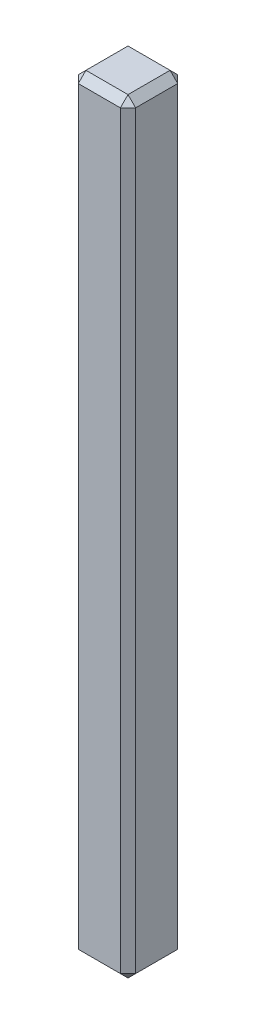
ISO-10303-21;
HEADER;
FILE_DESCRIPTION(('STEP AP214'),'2;1');
FILE_NAME('part.step','',(''),(''),'','','');
FILE_SCHEMA(('AUTOMOTIVE_DESIGN { 1 0 10303 214 1 1 1 1 }'));
ENDSEC;
DATA;
#1=APPLICATION_CONTEXT('core data for automotive mechanical design processes');
#2=APPLICATION_PROTOCOL_DEFINITION('international standard','automotive_design',2000,#1);
#3=PRODUCT_CONTEXT('',#1,'mechanical');
#4=PRODUCT('Part','Part','',(#3));
#5=PRODUCT_RELATED_PRODUCT_CATEGORY('part','',(#4));
#6=PRODUCT_DEFINITION_FORMATION('','',#4);
#7=PRODUCT_DEFINITION_CONTEXT('part definition',#1,'design');
#8=PRODUCT_DEFINITION('design','',#6,#7);
#9=PRODUCT_DEFINITION_SHAPE('','',#8);
#10=(LENGTH_UNIT() NAMED_UNIT(*) SI_UNIT(.MILLI.,.METRE.));
#11=(NAMED_UNIT(*) PLANE_ANGLE_UNIT() SI_UNIT($,.RADIAN.));
#12=(NAMED_UNIT(*) SI_UNIT($,.STERADIAN.) SOLID_ANGLE_UNIT());
#13=UNCERTAINTY_MEASURE_WITH_UNIT(LENGTH_MEASURE(1.E-05),#10,'distance_accuracy_value','');
#14=(GEOMETRIC_REPRESENTATION_CONTEXT(3) GLOBAL_UNCERTAINTY_ASSIGNED_CONTEXT((#13)) GLOBAL_UNIT_ASSIGNED_CONTEXT((#10,
#11,#12)) REPRESENTATION_CONTEXT('',''));
#15=CARTESIAN_POINT('',(0.,0.,0.));
#16=DIRECTION('',(0.,0.,1.));
#17=DIRECTION('',(1.,0.,0.));
#18=AXIS2_PLACEMENT_3D('',#15,#16,#17);
#19=CARTESIAN_POINT('',(0.,200.,0.));
#20=DIRECTION('',(1.,0.,0.));
#21=DIRECTION('',(0.,0.,-1.));
#22=AXIS2_PLACEMENT_3D('',#19,#20,#21);
#23=PLANE('',#22);
#24=DIRECTION('',(0.,-1.,0.));
#25=VECTOR('',#24,1.);
#26=CARTESIAN_POINT('',(0.,200.,-13.));
#27=LINE('',#26,#25);
#28=CARTESIAN_POINT('',(0.,198.,-13.));
#29=VERTEX_POINT('',#28);
#30=CARTESIAN_POINT('',(0.,2.,-13.));
#31=VERTEX_POINT('',#30);
#32=EDGE_CURVE('E273',#29,#31,#27,.T.);
#33=ORIENTED_EDGE('',*,*,#32,.T.);
#34=DIRECTION('',(0.,0.,1.));
#35=VECTOR('',#34,1.);
#36=CARTESIAN_POINT('',(0.,2.,0.));
#37=LINE('',#36,#35);
#38=CARTESIAN_POINT('',(0.,2.,-2.));
#39=VERTEX_POINT('',#38);
#40=EDGE_CURVE('E275',#31,#39,#37,.T.);
#41=ORIENTED_EDGE('',*,*,#40,.T.);
#42=DIRECTION('',(0.,1.,0.));
#43=VECTOR('',#42,1.);
#44=CARTESIAN_POINT('',(0.,200.,-2.));
#45=LINE('',#44,#43);
#46=CARTESIAN_POINT('',(0.,198.,-2.));
#47=VERTEX_POINT('',#46);
#48=EDGE_CURVE('E216',#39,#47,#45,.T.);
#49=ORIENTED_EDGE('',*,*,#48,.T.);
#50=DIRECTION('',(0.,0.,-1.));
#51=VECTOR('',#50,1.);
#52=CARTESIAN_POINT('',(0.,198.,0.));
#53=LINE('',#52,#51);
#54=EDGE_CURVE('E267',#47,#29,#53,.T.);
#55=ORIENTED_EDGE('',*,*,#54,.T.);
#56=EDGE_LOOP('',(#33,#41,#49,#55));
#57=FACE_BOUND('',#56,.T.);
#58=ADVANCED_FACE('F35',(#57),#23,.F.);
#59=CARTESIAN_POINT('',(0.,200.,0.));
#60=DIRECTION('',(0.,0.,-1.));
#61=DIRECTION('',(-1.,0.,0.));
#62=AXIS2_PLACEMENT_3D('',#59,#60,#61);
#63=PLANE('',#62);
#64=DIRECTION('',(-1.,0.,0.));
#65=VECTOR('',#64,1.);
#66=CARTESIAN_POINT('',(0.,198.,0.));
#67=LINE('',#66,#65);
#68=CARTESIAN_POINT('',(13.,198.,0.));
#69=VERTEX_POINT('',#68);
#70=CARTESIAN_POINT('',(2.,198.,0.));
#71=VERTEX_POINT('',#70);
#72=EDGE_CURVE('E284',#69,#71,#67,.T.);
#73=ORIENTED_EDGE('',*,*,#72,.T.);
#74=DIRECTION('',(0.,-1.,0.));
#75=VECTOR('',#74,1.);
#76=CARTESIAN_POINT('',(2.,200.,0.));
#77=LINE('',#76,#75);
#78=CARTESIAN_POINT('',(2.,2.,0.));
#79=VERTEX_POINT('',#78);
#80=EDGE_CURVE('E219',#71,#79,#77,.T.);
#81=ORIENTED_EDGE('',*,*,#80,.T.);
#82=DIRECTION('',(1.,0.,0.));
#83=VECTOR('',#82,1.);
#84=CARTESIAN_POINT('',(15.,2.,0.));
#85=LINE('',#84,#83);
#86=CARTESIAN_POINT('',(13.,2.,0.));
#87=VERTEX_POINT('',#86);
#88=EDGE_CURVE('E222',#79,#87,#85,.T.);
#89=ORIENTED_EDGE('',*,*,#88,.T.);
#90=DIRECTION('',(0.,1.,0.));
#91=VECTOR('',#90,1.);
#92=CARTESIAN_POINT('',(13.,200.,0.));
#93=LINE('',#92,#91);
#94=EDGE_CURVE('E225',#87,#69,#93,.T.);
#95=ORIENTED_EDGE('',*,*,#94,.T.);
#96=EDGE_LOOP('',(#73,#81,#89,#95));
#97=FACE_BOUND('',#96,.T.);
#98=ADVANCED_FACE('F287',(#97),#63,.F.);
#99=CARTESIAN_POINT('',(15.,200.,0.));
#100=DIRECTION('',(-1.,0.,0.));
#101=DIRECTION('',(0.,0.,1.));
#102=AXIS2_PLACEMENT_3D('',#99,#100,#101);
#103=PLANE('',#102);
#104=DIRECTION('',(0.,-1.,0.));
#105=VECTOR('',#104,1.);
#106=CARTESIAN_POINT('',(15.,200.,-2.));
#107=LINE('',#106,#105);
#108=CARTESIAN_POINT('',(15.,198.,-2.));
#109=VERTEX_POINT('',#108);
#110=CARTESIAN_POINT('',(15.,2.,-2.));
#111=VERTEX_POINT('',#110);
#112=EDGE_CURVE('E134',#109,#111,#107,.T.);
#113=ORIENTED_EDGE('',*,*,#112,.T.);
#114=DIRECTION('',(0.,0.,-1.));
#115=VECTOR('',#114,1.);
#116=CARTESIAN_POINT('',(15.,2.,-15.));
#117=LINE('',#116,#115);
#118=CARTESIAN_POINT('',(15.,2.,-13.));
#119=VERTEX_POINT('',#118);
#120=EDGE_CURVE('E130',#111,#119,#117,.T.);
#121=ORIENTED_EDGE('',*,*,#120,.T.);
#122=DIRECTION('',(0.,1.,0.));
#123=VECTOR('',#122,1.);
#124=CARTESIAN_POINT('',(15.,200.,-13.));
#125=LINE('',#124,#123);
#126=CARTESIAN_POINT('',(15.,198.,-13.));
#127=VERTEX_POINT('',#126);
#128=EDGE_CURVE('E124',#119,#127,#125,.T.);
#129=ORIENTED_EDGE('',*,*,#128,.T.);
#130=DIRECTION('',(0.,0.,1.));
#131=VECTOR('',#130,1.);
#132=CARTESIAN_POINT('',(15.,198.,0.));
#133=LINE('',#132,#131);
#134=EDGE_CURVE('E127',#127,#109,#133,.T.);
#135=ORIENTED_EDGE('',*,*,#134,.T.);
#136=EDGE_LOOP('',(#113,#121,#129,#135));
#137=FACE_BOUND('',#136,.T.);
#138=ADVANCED_FACE('F126',(#137),#103,.F.);
#139=CARTESIAN_POINT('',(0.,200.,-15.));
#140=DIRECTION('',(0.,0.,1.));
#141=DIRECTION('',(1.,0.,0.));
#142=AXIS2_PLACEMENT_3D('',#139,#140,#141);
#143=PLANE('',#142);
#144=DIRECTION('',(1.,0.,0.));
#145=VECTOR('',#144,1.);
#146=CARTESIAN_POINT('',(0.,198.,-15.));
#147=LINE('',#146,#145);
#148=CARTESIAN_POINT('',(2.,198.,-15.));
#149=VERTEX_POINT('',#148);
#150=CARTESIAN_POINT('',(13.,198.,-15.));
#151=VERTEX_POINT('',#150);
#152=EDGE_CURVE('E277',#149,#151,#147,.T.);
#153=ORIENTED_EDGE('',*,*,#152,.T.);
#154=DIRECTION('',(0.,-1.,0.));
#155=VECTOR('',#154,1.);
#156=CARTESIAN_POINT('',(13.,200.,-15.));
#157=LINE('',#156,#155);
#158=CARTESIAN_POINT('',(13.,2.,-15.));
#159=VERTEX_POINT('',#158);
#160=EDGE_CURVE('E156',#151,#159,#157,.T.);
#161=ORIENTED_EDGE('',*,*,#160,.T.);
#162=DIRECTION('',(-1.,0.,0.));
#163=VECTOR('',#162,1.);
#164=CARTESIAN_POINT('',(0.,2.,-15.));
#165=LINE('',#164,#163);
#166=CARTESIAN_POINT('',(2.,2.,-15.));
#167=VERTEX_POINT('',#166);
#168=EDGE_CURVE('E281',#159,#167,#165,.T.);
#169=ORIENTED_EDGE('',*,*,#168,.T.);
#170=DIRECTION('',(0.,1.,0.));
#171=VECTOR('',#170,1.);
#172=CARTESIAN_POINT('',(2.,200.,-15.));
#173=LINE('',#172,#171);
#174=EDGE_CURVE('E279',#167,#149,#173,.T.);
#175=ORIENTED_EDGE('',*,*,#174,.T.);
#176=EDGE_LOOP('',(#153,#161,#169,#175));
#177=FACE_BOUND('',#176,.T.);
#178=ADVANCED_FACE('F416',(#177),#143,.F.);
#179=CARTESIAN_POINT('',(0.,200.,0.));
#180=DIRECTION('',(0.,-1.,0.));
#181=DIRECTION('',(0.,0.,-1.));
#182=AXIS2_PLACEMENT_3D('',#179,#180,#181);
#183=PLANE('',#182);
#184=DIRECTION('',(0.,0.,-1.));
#185=VECTOR('',#184,1.);
#186=CARTESIAN_POINT('',(13.,200.,0.));
#187=LINE('',#186,#185);
#188=CARTESIAN_POINT('',(13.,200.,-2.));
#189=VERTEX_POINT('',#188);
#190=CARTESIAN_POINT('',(13.,200.,-13.));
#191=VERTEX_POINT('',#190);
#192=EDGE_CURVE('E45',#189,#191,#187,.T.);
#193=ORIENTED_EDGE('',*,*,#192,.T.);
#194=DIRECTION('',(-1.,0.,0.));
#195=VECTOR('',#194,1.);
#196=CARTESIAN_POINT('',(0.,200.,-13.));
#197=LINE('',#196,#195);
#198=CARTESIAN_POINT('',(2.,200.,-13.));
#199=VERTEX_POINT('',#198);
#200=EDGE_CURVE('E11',#191,#199,#197,.T.);
#201=ORIENTED_EDGE('',*,*,#200,.T.);
#202=DIRECTION('',(0.,0.,1.));
#203=VECTOR('',#202,1.);
#204=CARTESIAN_POINT('',(2.,200.,0.));
#205=LINE('',#204,#203);
#206=CARTESIAN_POINT('',(2.,200.,-2.));
#207=VERTEX_POINT('',#206);
#208=EDGE_CURVE('E221',#199,#207,#205,.T.);
#209=ORIENTED_EDGE('',*,*,#208,.T.);
#210=DIRECTION('',(1.,0.,0.));
#211=VECTOR('',#210,1.);
#212=CARTESIAN_POINT('',(0.,200.,-2.));
#213=LINE('',#212,#211);
#214=EDGE_CURVE('E56',#207,#189,#213,.T.);
#215=ORIENTED_EDGE('',*,*,#214,.T.);
#216=EDGE_LOOP('',(#193,#201,#209,#215));
#217=FACE_BOUND('',#216,.T.);
#218=ADVANCED_FACE('F411',(#217),#183,.F.);
#219=CARTESIAN_POINT('',(0.,0.,0.));
#220=DIRECTION('',(0.,-1.,0.));
#221=DIRECTION('',(0.,0.,-1.));
#222=AXIS2_PLACEMENT_3D('',#219,#220,#221);
#223=PLANE('',#222);
#224=DIRECTION('',(0.,0.,-1.));
#225=VECTOR('',#224,1.);
#226=CARTESIAN_POINT('',(2.,0.,-15.));
#227=LINE('',#226,#225);
#228=CARTESIAN_POINT('',(2.,0.,-2.));
#229=VERTEX_POINT('',#228);
#230=CARTESIAN_POINT('',(2.,0.,-13.));
#231=VERTEX_POINT('',#230);
#232=EDGE_CURVE('E256',#229,#231,#227,.T.);
#233=ORIENTED_EDGE('',*,*,#232,.T.);
#234=DIRECTION('',(1.,0.,0.));
#235=VECTOR('',#234,1.);
#236=CARTESIAN_POINT('',(15.,0.,-13.));
#237=LINE('',#236,#235);
#238=CARTESIAN_POINT('',(13.,0.,-13.));
#239=VERTEX_POINT('',#238);
#240=EDGE_CURVE('E262',#231,#239,#237,.T.);
#241=ORIENTED_EDGE('',*,*,#240,.T.);
#242=DIRECTION('',(0.,0.,1.));
#243=VECTOR('',#242,1.);
#244=CARTESIAN_POINT('',(13.,0.,0.));
#245=LINE('',#244,#243);
#246=CARTESIAN_POINT('',(13.,0.,-2.));
#247=VERTEX_POINT('',#246);
#248=EDGE_CURVE('E259',#239,#247,#245,.T.);
#249=ORIENTED_EDGE('',*,*,#248,.T.);
#250=DIRECTION('',(-1.,0.,0.));
#251=VECTOR('',#250,1.);
#252=CARTESIAN_POINT('',(0.,0.,-2.));
#253=LINE('',#252,#251);
#254=EDGE_CURVE('E250',#247,#229,#253,.T.);
#255=ORIENTED_EDGE('',*,*,#254,.T.);
#256=EDGE_LOOP('',(#233,#241,#249,#255));
#257=FACE_BOUND('',#256,.T.);
#258=ADVANCED_FACE('F260',(#257),#223,.T.);
#259=CARTESIAN_POINT('',(2.,200.,0.));
#260=DIRECTION('',(0.707106781186547,-0.707106781186547,0.));
#261=DIRECTION('',(0.,0.,1.));
#262=AXIS2_PLACEMENT_3D('',#259,#260,#261);
#263=PLANE('',#262);
#264=DIRECTION('',(0.707106781186547,0.707106781186547,0.));
#265=VECTOR('',#264,1.);
#266=CARTESIAN_POINT('',(0.,198.,-2.));
#267=LINE('',#266,#265);
#268=EDGE_CURVE('E40',#207,#47,#267,.F.);
#269=ORIENTED_EDGE('',*,*,#268,.F.);
#270=ORIENTED_EDGE('',*,*,#208,.F.);
#271=DIRECTION('',(-0.707106781186547,-0.707106781186547,0.));
#272=VECTOR('',#271,1.);
#273=CARTESIAN_POINT('',(1.,199.,-13.));
#274=LINE('',#273,#272);
#275=EDGE_CURVE('E196',#29,#199,#274,.F.);
#276=ORIENTED_EDGE('',*,*,#275,.F.);
#277=ORIENTED_EDGE('',*,*,#54,.F.);
#278=EDGE_LOOP('',(#269,#270,#276,#277));
#279=FACE_BOUND('',#278,.T.);
#280=ADVANCED_FACE('F38',(#279),#263,.F.);
#281=CARTESIAN_POINT('',(0.,198.,-2.));
#282=DIRECTION('',(-0.577350269189626,0.577350269189626,0.577350269189626));
#283=DIRECTION('',(0.707106781186547,0.,0.707106781186547));
#284=AXIS2_PLACEMENT_3D('',#281,#282,#283);
#285=PLANE('',#284);
#286=DIRECTION('',(0.,-0.707106781186547,0.707106781186547));
#287=VECTOR('',#286,1.);
#288=CARTESIAN_POINT('',(2.,199.,-1.));
#289=LINE('',#288,#287);
#290=EDGE_CURVE('E191',#207,#71,#289,.T.);
#291=ORIENTED_EDGE('',*,*,#290,.F.);
#292=ORIENTED_EDGE('',*,*,#268,.T.);
#293=DIRECTION('',(-0.707106781186547,0.,-0.707106781186547));
#294=VECTOR('',#293,1.);
#295=CARTESIAN_POINT('',(0.,198.,-2.));
#296=LINE('',#295,#294);
#297=EDGE_CURVE('E194',#71,#47,#296,.T.);
#298=ORIENTED_EDGE('',*,*,#297,.F.);
#299=EDGE_LOOP('',(#291,#292,#298));
#300=FACE_BOUND('',#299,.T.);
#301=ADVANCED_FACE('F208',(#300),#285,.T.);
#302=CARTESIAN_POINT('',(2.,198.,-15.));
#303=DIRECTION('',(-0.577350269189626,0.577350269189626,-0.577350269189626));
#304=DIRECTION('',(-0.707106781186547,0.,0.707106781186547));
#305=AXIS2_PLACEMENT_3D('',#302,#303,#304);
#306=PLANE('',#305);
#307=DIRECTION('',(0.707106781186547,0.,-0.707106781186547));
#308=VECTOR('',#307,1.);
#309=CARTESIAN_POINT('',(2.,198.,-15.));
#310=LINE('',#309,#308);
#311=EDGE_CURVE('E186',#29,#149,#310,.T.);
#312=ORIENTED_EDGE('',*,*,#311,.F.);
#313=ORIENTED_EDGE('',*,*,#275,.T.);
#314=DIRECTION('',(0.,0.707106781186547,0.707106781186547));
#315=VECTOR('',#314,1.);
#316=CARTESIAN_POINT('',(2.,198.,-15.));
#317=LINE('',#316,#315);
#318=EDGE_CURVE('E189',#149,#199,#317,.T.);
#319=ORIENTED_EDGE('',*,*,#318,.F.);
#320=EDGE_LOOP('',(#312,#313,#319));
#321=FACE_BOUND('',#320,.T.);
#322=ADVANCED_FACE('F398',(#321),#306,.T.);
#323=CARTESIAN_POINT('',(2.,200.,0.));
#324=DIRECTION('',(0.707106781186547,0.,-0.707106781186547));
#325=DIRECTION('',(0.,-1.,0.));
#326=AXIS2_PLACEMENT_3D('',#323,#324,#325);
#327=PLANE('',#326);
#328=ORIENTED_EDGE('',*,*,#297,.T.);
#329=ORIENTED_EDGE('',*,*,#48,.F.);
#330=DIRECTION('',(0.707106781186547,0.,0.707106781186547));
#331=VECTOR('',#330,1.);
#332=CARTESIAN_POINT('',(0.,2.,-2.));
#333=LINE('',#332,#331);
#334=EDGE_CURVE('E181',#79,#39,#333,.F.);
#335=ORIENTED_EDGE('',*,*,#334,.F.);
#336=ORIENTED_EDGE('',*,*,#80,.F.);
#337=EDGE_LOOP('',(#328,#329,#335,#336));
#338=FACE_BOUND('',#337,.T.);
#339=ADVANCED_FACE('F214',(#338),#327,.F.);
#340=CARTESIAN_POINT('',(0.,200.,-2.));
#341=DIRECTION('',(0.,-0.707106781186547,-0.707106781186547));
#342=DIRECTION('',(1.,0.,0.));
#343=AXIS2_PLACEMENT_3D('',#340,#341,#342);
#344=PLANE('',#343);
#345=ORIENTED_EDGE('',*,*,#290,.T.);
#346=ORIENTED_EDGE('',*,*,#72,.F.);
#347=DIRECTION('',(0.,0.707106781186547,-0.707106781186547));
#348=VECTOR('',#347,1.);
#349=CARTESIAN_POINT('',(13.,198.,0.));
#350=LINE('',#349,#348);
#351=EDGE_CURVE('E178',#189,#69,#350,.F.);
#352=ORIENTED_EDGE('',*,*,#351,.F.);
#353=ORIENTED_EDGE('',*,*,#214,.F.);
#354=EDGE_LOOP('',(#345,#346,#352,#353));
#355=FACE_BOUND('',#354,.T.);
#356=ADVANCED_FACE('F291',(#355),#344,.F.);
#357=CARTESIAN_POINT('',(13.,200.,0.));
#358=DIRECTION('',(-0.707106781186547,-0.707106781186547,0.));
#359=DIRECTION('',(0.,0.,-1.));
#360=AXIS2_PLACEMENT_3D('',#357,#358,#359);
#361=PLANE('',#360);
#362=DIRECTION('',(-0.707106781186547,0.707106781186547,0.));
#363=VECTOR('',#362,1.);
#364=CARTESIAN_POINT('',(15.,198.,-13.));
#365=LINE('',#364,#363);
#366=EDGE_CURVE('E140',#191,#127,#365,.F.);
#367=ORIENTED_EDGE('',*,*,#366,.F.);
#368=ORIENTED_EDGE('',*,*,#192,.F.);
#369=DIRECTION('',(0.707106781186547,-0.707106781186547,0.));
#370=VECTOR('',#369,1.);
#371=CARTESIAN_POINT('',(14.,199.,-2.));
#372=LINE('',#371,#370);
#373=EDGE_CURVE('E143',#109,#189,#372,.F.);
#374=ORIENTED_EDGE('',*,*,#373,.F.);
#375=ORIENTED_EDGE('',*,*,#134,.F.);
#376=EDGE_LOOP('',(#367,#368,#374,#375));
#377=FACE_BOUND('',#376,.T.);
#378=ADVANCED_FACE('F139',(#377),#361,.F.);
#379=CARTESIAN_POINT('',(0.,200.,-13.));
#380=DIRECTION('',(0.,-0.707106781186547,0.707106781186547));
#381=DIRECTION('',(-1.,0.,0.));
#382=AXIS2_PLACEMENT_3D('',#379,#380,#381);
#383=PLANE('',#382);
#384=ORIENTED_EDGE('',*,*,#318,.T.);
#385=ORIENTED_EDGE('',*,*,#200,.F.);
#386=DIRECTION('',(0.,-0.707106781186547,-0.707106781186547));
#387=VECTOR('',#386,1.);
#388=CARTESIAN_POINT('',(13.,199.,-14.));
#389=LINE('',#388,#387);
#390=EDGE_CURVE('E152',#151,#191,#389,.F.);
#391=ORIENTED_EDGE('',*,*,#390,.F.);
#392=ORIENTED_EDGE('',*,*,#152,.F.);
#393=EDGE_LOOP('',(#384,#385,#391,#392));
#394=FACE_BOUND('',#393,.T.);
#395=ADVANCED_FACE('F381',(#394),#383,.F.);
#396=CARTESIAN_POINT('',(0.,200.,-13.));
#397=DIRECTION('',(0.707106781186547,0.,0.707106781186547));
#398=DIRECTION('',(0.,-1.,0.));
#399=AXIS2_PLACEMENT_3D('',#396,#397,#398);
#400=PLANE('',#399);
#401=ORIENTED_EDGE('',*,*,#311,.T.);
#402=ORIENTED_EDGE('',*,*,#174,.F.);
#403=DIRECTION('',(-0.707106781186547,0.,0.707106781186547));
#404=VECTOR('',#403,1.);
#405=CARTESIAN_POINT('',(1.,2.,-14.));
#406=LINE('',#405,#404);
#407=EDGE_CURVE('E173',#31,#167,#406,.F.);
#408=ORIENTED_EDGE('',*,*,#407,.F.);
#409=ORIENTED_EDGE('',*,*,#32,.F.);
#410=EDGE_LOOP('',(#401,#402,#408,#409));
#411=FACE_BOUND('',#410,.T.);
#412=ADVANCED_FACE('F376',(#411),#400,.F.);
#413=CARTESIAN_POINT('',(0.,2.,0.));
#414=DIRECTION('',(-0.707106781186547,-0.707106781186547,0.));
#415=DIRECTION('',(0.,0.,-1.));
#416=AXIS2_PLACEMENT_3D('',#413,#414,#415);
#417=PLANE('',#416);
#418=DIRECTION('',(0.707106781186547,-0.707106781186547,0.));
#419=VECTOR('',#418,1.);
#420=CARTESIAN_POINT('',(0.,2.,-2.));
#421=LINE('',#420,#419);
#422=EDGE_CURVE('E183',#39,#229,#421,.T.);
#423=ORIENTED_EDGE('',*,*,#422,.F.);
#424=ORIENTED_EDGE('',*,*,#40,.F.);
#425=DIRECTION('',(-0.707106781186547,0.707106781186547,0.));
#426=VECTOR('',#425,1.);
#427=CARTESIAN_POINT('',(2.,0.,-13.));
#428=LINE('',#427,#426);
#429=EDGE_CURVE('E170',#231,#31,#428,.T.);
#430=ORIENTED_EDGE('',*,*,#429,.F.);
#431=ORIENTED_EDGE('',*,*,#232,.F.);
#432=EDGE_LOOP('',(#423,#424,#430,#431));
#433=FACE_BOUND('',#432,.T.);
#434=ADVANCED_FACE('F371',(#433),#417,.T.);
#435=CARTESIAN_POINT('',(0.,2.,-2.));
#436=DIRECTION('',(-0.577350269189626,-0.577350269189626,0.577350269189626));
#437=DIRECTION('',(0.707106781186547,0.,0.707106781186547));
#438=AXIS2_PLACEMENT_3D('',#435,#436,#437);
#439=PLANE('',#438);
#440=ORIENTED_EDGE('',*,*,#334,.T.);
#441=ORIENTED_EDGE('',*,*,#422,.T.);
#442=DIRECTION('',(0.,0.707106781186547,0.707106781186547));
#443=VECTOR('',#442,1.);
#444=CARTESIAN_POINT('',(2.,1.,-1.));
#445=LINE('',#444,#443);
#446=EDGE_CURVE('E161',#79,#229,#445,.F.);
#447=ORIENTED_EDGE('',*,*,#446,.F.);
#448=EDGE_LOOP('',(#440,#441,#447));
#449=FACE_BOUND('',#448,.T.);
#450=ADVANCED_FACE('F366',(#449),#439,.T.);
#451=CARTESIAN_POINT('',(13.,198.,0.));
#452=DIRECTION('',(0.577350269189626,0.577350269189626,0.577350269189626));
#453=DIRECTION('',(0.707106781186547,0.,-0.707106781186547));
#454=AXIS2_PLACEMENT_3D('',#451,#452,#453);
#455=PLANE('',#454);
#456=ORIENTED_EDGE('',*,*,#373,.T.);
#457=ORIENTED_EDGE('',*,*,#351,.T.);
#458=DIRECTION('',(-0.707106781186547,0.,0.707106781186547));
#459=VECTOR('',#458,1.);
#460=CARTESIAN_POINT('',(13.,198.,0.));
#461=LINE('',#460,#459);
#462=EDGE_CURVE('E157',#109,#69,#461,.T.);
#463=ORIENTED_EDGE('',*,*,#462,.F.);
#464=EDGE_LOOP('',(#456,#457,#463));
#465=FACE_BOUND('',#464,.T.);
#466=ADVANCED_FACE('F293',(#465),#455,.T.);
#467=CARTESIAN_POINT('',(15.,198.,-13.));
#468=DIRECTION('',(0.577350269189626,0.577350269189626,-0.577350269189626));
#469=DIRECTION('',(-0.707106781186547,0.,-0.707106781186547));
#470=AXIS2_PLACEMENT_3D('',#467,#468,#469);
#471=PLANE('',#470);
#472=ORIENTED_EDGE('',*,*,#390,.T.);
#473=ORIENTED_EDGE('',*,*,#366,.T.);
#474=DIRECTION('',(0.707106781186547,0.,0.707106781186547));
#475=VECTOR('',#474,1.);
#476=CARTESIAN_POINT('',(15.,198.,-13.));
#477=LINE('',#476,#475);
#478=EDGE_CURVE('E149',#151,#127,#477,.T.);
#479=ORIENTED_EDGE('',*,*,#478,.F.);
#480=EDGE_LOOP('',(#472,#473,#479));
#481=FACE_BOUND('',#480,.T.);
#482=ADVANCED_FACE('F148',(#481),#471,.T.);
#483=CARTESIAN_POINT('',(2.,0.,-13.));
#484=DIRECTION('',(-0.577350269189626,-0.577350269189626,-0.577350269189626));
#485=DIRECTION('',(-0.707106781186547,0.,0.707106781186547));
#486=AXIS2_PLACEMENT_3D('',#483,#484,#485);
#487=PLANE('',#486);
#488=ORIENTED_EDGE('',*,*,#429,.T.);
#489=ORIENTED_EDGE('',*,*,#407,.T.);
#490=DIRECTION('',(0.,-0.707106781186547,0.707106781186547));
#491=VECTOR('',#490,1.);
#492=CARTESIAN_POINT('',(2.,0.,-13.));
#493=LINE('',#492,#491);
#494=EDGE_CURVE('E158',#231,#167,#493,.F.);
#495=ORIENTED_EDGE('',*,*,#494,.F.);
#496=EDGE_LOOP('',(#488,#489,#495));
#497=FACE_BOUND('',#496,.T.);
#498=ADVANCED_FACE('F306',(#497),#487,.T.);
#499=CARTESIAN_POINT('',(0.,2.,0.));
#500=DIRECTION('',(0.,-0.707106781186547,0.707106781186547));
#501=DIRECTION('',(-1.,0.,0.));
#502=AXIS2_PLACEMENT_3D('',#499,#500,#501);
#503=PLANE('',#502);
#504=ORIENTED_EDGE('',*,*,#446,.T.);
#505=ORIENTED_EDGE('',*,*,#254,.F.);
#506=DIRECTION('',(0.,-0.707106781186547,-0.707106781186547));
#507=VECTOR('',#506,1.);
#508=CARTESIAN_POINT('',(13.,0.,-2.));
#509=LINE('',#508,#507);
#510=EDGE_CURVE('E164',#87,#247,#509,.T.);
#511=ORIENTED_EDGE('',*,*,#510,.F.);
#512=ORIENTED_EDGE('',*,*,#88,.F.);
#513=EDGE_LOOP('',(#504,#505,#511,#512));
#514=FACE_BOUND('',#513,.T.);
#515=ADVANCED_FACE('F252',(#514),#503,.T.);
#516=CARTESIAN_POINT('',(15.,200.,-2.));
#517=DIRECTION('',(-0.707106781186547,0.,-0.707106781186547));
#518=DIRECTION('',(0.,-1.,0.));
#519=AXIS2_PLACEMENT_3D('',#516,#517,#518);
#520=PLANE('',#519);
#521=ORIENTED_EDGE('',*,*,#462,.T.);
#522=ORIENTED_EDGE('',*,*,#94,.F.);
#523=DIRECTION('',(0.707106781186547,0.,-0.707106781186547));
#524=VECTOR('',#523,1.);
#525=CARTESIAN_POINT('',(14.,2.,-1.));
#526=LINE('',#525,#524);
#527=EDGE_CURVE('E240',#111,#87,#526,.F.);
#528=ORIENTED_EDGE('',*,*,#527,.F.);
#529=ORIENTED_EDGE('',*,*,#112,.F.);
#530=EDGE_LOOP('',(#521,#522,#528,#529));
#531=FACE_BOUND('',#530,.T.);
#532=ADVANCED_FACE('F295',(#531),#520,.F.);
#533=CARTESIAN_POINT('',(13.,200.,-15.));
#534=DIRECTION('',(-0.707106781186547,0.,0.707106781186547));
#535=DIRECTION('',(0.,-1.,0.));
#536=AXIS2_PLACEMENT_3D('',#533,#534,#535);
#537=PLANE('',#536);
#538=ORIENTED_EDGE('',*,*,#478,.T.);
#539=ORIENTED_EDGE('',*,*,#128,.F.);
#540=DIRECTION('',(-0.707106781186547,0.,-0.707106781186547));
#541=VECTOR('',#540,1.);
#542=CARTESIAN_POINT('',(15.,2.,-13.));
#543=LINE('',#542,#541);
#544=EDGE_CURVE('E237',#159,#119,#543,.F.);
#545=ORIENTED_EDGE('',*,*,#544,.F.);
#546=ORIENTED_EDGE('',*,*,#160,.F.);
#547=EDGE_LOOP('',(#538,#539,#545,#546));
#548=FACE_BOUND('',#547,.T.);
#549=ADVANCED_FACE('F154',(#548),#537,.F.);
#550=CARTESIAN_POINT('',(0.,2.,-15.));
#551=DIRECTION('',(0.,-0.707106781186547,-0.707106781186547));
#552=DIRECTION('',(1.,0.,0.));
#553=AXIS2_PLACEMENT_3D('',#550,#551,#552);
#554=PLANE('',#553);
#555=ORIENTED_EDGE('',*,*,#494,.T.);
#556=ORIENTED_EDGE('',*,*,#168,.F.);
#557=DIRECTION('',(0.,0.707106781186547,-0.707106781186547));
#558=VECTOR('',#557,1.);
#559=CARTESIAN_POINT('',(13.,1.,-14.));
#560=LINE('',#559,#558);
#561=EDGE_CURVE('E235',#239,#159,#560,.T.);
#562=ORIENTED_EDGE('',*,*,#561,.F.);
#563=ORIENTED_EDGE('',*,*,#240,.F.);
#564=EDGE_LOOP('',(#555,#556,#562,#563));
#565=FACE_BOUND('',#564,.T.);
#566=ADVANCED_FACE('F304',(#565),#554,.T.);
#567=CARTESIAN_POINT('',(13.,0.,-2.));
#568=DIRECTION('',(0.577350269189626,-0.577350269189626,0.577350269189626));
#569=DIRECTION('',(0.707106781186547,0.,-0.707106781186547));
#570=AXIS2_PLACEMENT_3D('',#567,#568,#569);
#571=PLANE('',#570);
#572=ORIENTED_EDGE('',*,*,#527,.T.);
#573=ORIENTED_EDGE('',*,*,#510,.T.);
#574=DIRECTION('',(0.707106781186547,0.707106781186547,0.));
#575=VECTOR('',#574,1.);
#576=CARTESIAN_POINT('',(13.,0.,-2.));
#577=LINE('',#576,#575);
#578=EDGE_CURVE('E233',#111,#247,#577,.F.);
#579=ORIENTED_EDGE('',*,*,#578,.F.);
#580=EDGE_LOOP('',(#572,#573,#579));
#581=FACE_BOUND('',#580,.T.);
#582=ADVANCED_FACE('F247',(#581),#571,.T.);
#583=CARTESIAN_POINT('',(15.,2.,-13.));
#584=DIRECTION('',(0.577350269189626,-0.577350269189626,-0.577350269189626));
#585=DIRECTION('',(-0.707106781186547,0.,-0.707106781186547));
#586=AXIS2_PLACEMENT_3D('',#583,#584,#585);
#587=PLANE('',#586);
#588=ORIENTED_EDGE('',*,*,#561,.T.);
#589=ORIENTED_EDGE('',*,*,#544,.T.);
#590=DIRECTION('',(-0.707106781186547,-0.707106781186547,0.));
#591=VECTOR('',#590,1.);
#592=CARTESIAN_POINT('',(15.,2.,-13.));
#593=LINE('',#592,#591);
#594=EDGE_CURVE('E231',#239,#119,#593,.F.);
#595=ORIENTED_EDGE('',*,*,#594,.F.);
#596=EDGE_LOOP('',(#588,#589,#595));
#597=FACE_BOUND('',#596,.T.);
#598=ADVANCED_FACE('F325',(#597),#587,.T.);
#599=CARTESIAN_POINT('',(15.,2.,0.));
#600=DIRECTION('',(0.707106781186547,-0.707106781186547,0.));
#601=DIRECTION('',(0.,0.,1.));
#602=AXIS2_PLACEMENT_3D('',#599,#600,#601);
#603=PLANE('',#602);
#604=ORIENTED_EDGE('',*,*,#578,.T.);
#605=ORIENTED_EDGE('',*,*,#248,.F.);
#606=ORIENTED_EDGE('',*,*,#594,.T.);
#607=ORIENTED_EDGE('',*,*,#120,.F.);
#608=EDGE_LOOP('',(#604,#605,#606,#607));
#609=FACE_BOUND('',#608,.T.);
#610=ADVANCED_FACE('F319',(#609),#603,.T.);
#611=CLOSED_SHELL('',(#58,#98,#138,#178,#218,#258,#280,#301,#322,#339,#356,#378,#395,#412,#434,
#450,#466,#482,#498,#515,#532,#549,#566,#582,#598,#610));
#612=MANIFOLD_SOLID_BREP('B2',#611);
#613=ADVANCED_BREP_SHAPE_REPRESENTATION('',(#18,#612),#14);
#614=SHAPE_DEFINITION_REPRESENTATION(#9,#613);
ENDSEC;
END-ISO-10303-21;
